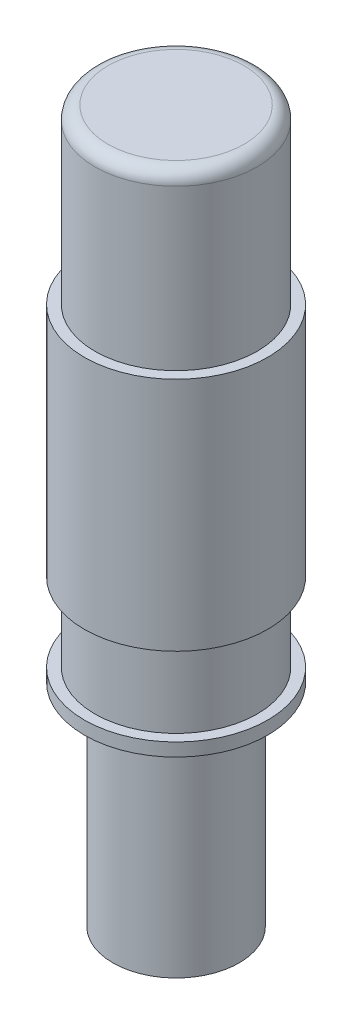
ISO-10303-21;
HEADER;
FILE_DESCRIPTION(('STEP AP214'),'2;1');
FILE_NAME('part.step','',(''),(''),'','','');
FILE_SCHEMA(('AUTOMOTIVE_DESIGN { 1 0 10303 214 1 1 1 1 }'));
ENDSEC;
DATA;
#1=APPLICATION_CONTEXT('core data for automotive mechanical design processes');
#2=APPLICATION_PROTOCOL_DEFINITION('international standard','automotive_design',2000,#1);
#3=PRODUCT_CONTEXT('',#1,'mechanical');
#4=PRODUCT('Part','Part','',(#3));
#5=PRODUCT_RELATED_PRODUCT_CATEGORY('part','',(#4));
#6=PRODUCT_DEFINITION_FORMATION('','',#4);
#7=PRODUCT_DEFINITION_CONTEXT('part definition',#1,'design');
#8=PRODUCT_DEFINITION('design','',#6,#7);
#9=PRODUCT_DEFINITION_SHAPE('','',#8);
#10=(LENGTH_UNIT() NAMED_UNIT(*) SI_UNIT(.MILLI.,.METRE.));
#11=(NAMED_UNIT(*) PLANE_ANGLE_UNIT() SI_UNIT($,.RADIAN.));
#12=(NAMED_UNIT(*) SI_UNIT($,.STERADIAN.) SOLID_ANGLE_UNIT());
#13=UNCERTAINTY_MEASURE_WITH_UNIT(LENGTH_MEASURE(1.E-05),#10,'distance_accuracy_value','');
#14=(GEOMETRIC_REPRESENTATION_CONTEXT(3) GLOBAL_UNCERTAINTY_ASSIGNED_CONTEXT((#13)) GLOBAL_UNIT_ASSIGNED_CONTEXT((#10,
#11,#12)) REPRESENTATION_CONTEXT('',''));
#15=CARTESIAN_POINT('',(0.,0.,0.));
#16=DIRECTION('',(0.,0.,1.));
#17=DIRECTION('',(1.,0.,0.));
#18=AXIS2_PLACEMENT_3D('',#15,#16,#17);
#19=CARTESIAN_POINT('',(0.,0.5,0.));
#20=DIRECTION('',(0.,-1.,0.));
#21=DIRECTION('',(0.,0.,-1.));
#22=AXIS2_PLACEMENT_3D('',#19,#20,#21);
#23=CYLINDRICAL_SURFACE('',#22,3.5);
#24=CARTESIAN_POINT('',(0.,0.5,0.));
#25=DIRECTION('',(0.,1.,0.));
#26=DIRECTION('',(0.,0.,1.));
#27=AXIS2_PLACEMENT_3D('',#24,#25,#26);
#28=CIRCLE('',#27,3.5);
#29=CARTESIAN_POINT('',(0.,0.5,3.5));
#30=VERTEX_POINT('',#29);
#31=EDGE_CURVE('E100',#30,#30,#28,.T.);
#32=ORIENTED_EDGE('',*,*,#31,.F.);
#33=EDGE_LOOP('',(#32));
#34=FACE_BOUND('',#33,.T.);
#35=CARTESIAN_POINT('',(0.,0.,0.));
#36=DIRECTION('',(0.,1.,0.));
#37=DIRECTION('',(0.,0.,1.));
#38=AXIS2_PLACEMENT_3D('',#35,#36,#37);
#39=CIRCLE('',#38,3.5);
#40=CARTESIAN_POINT('',(0.,0.,3.5));
#41=VERTEX_POINT('',#40);
#42=EDGE_CURVE('E97',#41,#41,#39,.T.);
#43=ORIENTED_EDGE('',*,*,#42,.T.);
#44=EDGE_LOOP('',(#43));
#45=FACE_BOUND('',#44,.T.);
#46=ADVANCED_FACE('F38',(#34,#45),#23,.T.);
#47=CARTESIAN_POINT('',(0.,0.5,0.));
#48=DIRECTION('',(0.,1.,0.));
#49=DIRECTION('',(0.,0.,1.));
#50=AXIS2_PLACEMENT_3D('',#47,#48,#49);
#51=PLANE('',#50);
#52=CARTESIAN_POINT('',(0.,0.5,0.));
#53=DIRECTION('',(0.,1.,0.));
#54=DIRECTION('',(0.,0.,1.));
#55=AXIS2_PLACEMENT_3D('',#52,#53,#54);
#56=CIRCLE('',#55,3.1);
#57=CARTESIAN_POINT('',(0.,0.5,3.1));
#58=VERTEX_POINT('',#57);
#59=EDGE_CURVE('E91',#58,#58,#56,.T.);
#60=ORIENTED_EDGE('',*,*,#59,.F.);
#61=EDGE_LOOP('',(#60));
#62=FACE_BOUND('',#61,.T.);
#63=ORIENTED_EDGE('',*,*,#31,.T.);
#64=EDGE_LOOP('',(#63));
#65=FACE_BOUND('',#64,.T.);
#66=ADVANCED_FACE('F120',(#62,#65),#51,.T.);
#67=CARTESIAN_POINT('',(0.,0.,0.));
#68=DIRECTION('',(0.,1.,0.));
#69=DIRECTION('',(0.,0.,1.));
#70=AXIS2_PLACEMENT_3D('',#67,#68,#69);
#71=PLANE('',#70);
#72=DIRECTION('',(1.,0.,0.));
#73=VECTOR('',#72,1.);
#74=CARTESIAN_POINT('',(0.,0.,-1.905));
#75=LINE('',#74,#73);
#76=CARTESIAN_POINT('',(-1.48106178129071,0.,-1.905));
#77=VERTEX_POINT('',#76);
#78=CARTESIAN_POINT('',(1.48106178129071,0.,-1.905));
#79=VERTEX_POINT('',#78);
#80=EDGE_CURVE('E65',#77,#79,#75,.T.);
#81=ORIENTED_EDGE('',*,*,#80,.F.);
#82=CARTESIAN_POINT('',(0.,0.,0.));
#83=DIRECTION('',(0.,-1.,0.));
#84=DIRECTION('',(0.,0.,-1.));
#85=AXIS2_PLACEMENT_3D('',#82,#83,#84);
#86=CIRCLE('',#85,2.413);
#87=EDGE_CURVE('E52',#79,#77,#86,.T.);
#88=ORIENTED_EDGE('',*,*,#87,.F.);
#89=EDGE_LOOP('',(#81,#88));
#90=FACE_BOUND('',#89,.T.);
#91=ORIENTED_EDGE('',*,*,#42,.F.);
#92=EDGE_LOOP('',(#91));
#93=FACE_BOUND('',#92,.T.);
#94=ADVANCED_FACE('F66',(#90,#93),#71,.F.);
#95=CARTESIAN_POINT('',(0.,3.5,0.));
#96=DIRECTION('',(0.,-1.,0.));
#97=DIRECTION('',(0.,0.,-1.));
#98=AXIS2_PLACEMENT_3D('',#95,#96,#97);
#99=CYLINDRICAL_SURFACE('',#98,3.1);
#100=CARTESIAN_POINT('',(0.,3.5,0.));
#101=DIRECTION('',(0.,1.,0.));
#102=DIRECTION('',(0.,0.,1.));
#103=AXIS2_PLACEMENT_3D('',#100,#101,#102);
#104=CIRCLE('',#103,3.1);
#105=CARTESIAN_POINT('',(0.,3.5,3.1));
#106=VERTEX_POINT('',#105);
#107=EDGE_CURVE('E94',#106,#106,#104,.T.);
#108=ORIENTED_EDGE('',*,*,#107,.F.);
#109=EDGE_LOOP('',(#108));
#110=FACE_BOUND('',#109,.T.);
#111=ORIENTED_EDGE('',*,*,#59,.T.);
#112=EDGE_LOOP('',(#111));
#113=FACE_BOUND('',#112,.T.);
#114=ADVANCED_FACE('F131',(#110,#113),#99,.T.);
#115=CARTESIAN_POINT('',(0.,12.5,0.));
#116=DIRECTION('',(0.,-1.,0.));
#117=DIRECTION('',(0.,0.,-1.));
#118=AXIS2_PLACEMENT_3D('',#115,#116,#117);
#119=CYLINDRICAL_SURFACE('',#118,3.5);
#120=CARTESIAN_POINT('',(0.,12.5,0.));
#121=DIRECTION('',(0.,1.,0.));
#122=DIRECTION('',(0.,0.,1.));
#123=AXIS2_PLACEMENT_3D('',#120,#121,#122);
#124=CIRCLE('',#123,3.5);
#125=CARTESIAN_POINT('',(0.,12.5,3.5));
#126=VERTEX_POINT('',#125);
#127=EDGE_CURVE('E88',#126,#126,#124,.T.);
#128=ORIENTED_EDGE('',*,*,#127,.F.);
#129=EDGE_LOOP('',(#128));
#130=FACE_BOUND('',#129,.T.);
#131=CARTESIAN_POINT('',(0.,3.5,0.));
#132=DIRECTION('',(0.,1.,0.));
#133=DIRECTION('',(0.,0.,1.));
#134=AXIS2_PLACEMENT_3D('',#131,#132,#133);
#135=CIRCLE('',#134,3.5);
#136=CARTESIAN_POINT('',(0.,3.5,3.5));
#137=VERTEX_POINT('',#136);
#138=EDGE_CURVE('E87',#137,#137,#135,.T.);
#139=ORIENTED_EDGE('',*,*,#138,.T.);
#140=EDGE_LOOP('',(#139));
#141=FACE_BOUND('',#140,.T.);
#142=ADVANCED_FACE('F135',(#130,#141),#119,.T.);
#143=CARTESIAN_POINT('',(0.,12.5,0.));
#144=DIRECTION('',(0.,1.,0.));
#145=DIRECTION('',(0.,0.,1.));
#146=AXIS2_PLACEMENT_3D('',#143,#144,#145);
#147=PLANE('',#146);
#148=CARTESIAN_POINT('',(0.,12.5,0.));
#149=DIRECTION('',(0.,1.,0.));
#150=DIRECTION('',(0.,0.,1.));
#151=AXIS2_PLACEMENT_3D('',#148,#149,#150);
#152=CIRCLE('',#151,3.1);
#153=CARTESIAN_POINT('',(0.,12.5,3.1));
#154=VERTEX_POINT('',#153);
#155=EDGE_CURVE('E81',#154,#154,#152,.T.);
#156=ORIENTED_EDGE('',*,*,#155,.F.);
#157=EDGE_LOOP('',(#156));
#158=FACE_BOUND('',#157,.T.);
#159=ORIENTED_EDGE('',*,*,#127,.T.);
#160=EDGE_LOOP('',(#159));
#161=FACE_BOUND('',#160,.T.);
#162=ADVANCED_FACE('F139',(#158,#161),#147,.T.);
#163=CARTESIAN_POINT('',(0.,3.5,0.));
#164=DIRECTION('',(0.,1.,0.));
#165=DIRECTION('',(0.,0.,1.));
#166=AXIS2_PLACEMENT_3D('',#163,#164,#165);
#167=PLANE('',#166);
#168=ORIENTED_EDGE('',*,*,#107,.T.);
#169=EDGE_LOOP('',(#168));
#170=FACE_BOUND('',#169,.T.);
#171=ORIENTED_EDGE('',*,*,#138,.F.);
#172=EDGE_LOOP('',(#171));
#173=FACE_BOUND('',#172,.T.);
#174=ADVANCED_FACE('F141',(#170,#173),#167,.F.);
#175=CARTESIAN_POINT('',(0.,19.1,0.));
#176=DIRECTION('',(0.,-1.,0.));
#177=DIRECTION('',(0.,0.,-1.));
#178=AXIS2_PLACEMENT_3D('',#175,#176,#177);
#179=CYLINDRICAL_SURFACE('',#178,3.1);
#180=CARTESIAN_POINT('',(0.,18.6,0.));
#181=DIRECTION('',(0.,1.,0.));
#182=DIRECTION('',(0.,0.,1.));
#183=AXIS2_PLACEMENT_3D('',#180,#181,#182);
#184=CIRCLE('',#183,3.1);
#185=CARTESIAN_POINT('',(0.,18.6,3.1));
#186=VERTEX_POINT('',#185);
#187=EDGE_CURVE('E11',#186,#186,#184,.F.);
#188=ORIENTED_EDGE('',*,*,#187,.T.);
#189=EDGE_LOOP('',(#188));
#190=FACE_BOUND('',#189,.T.);
#191=ORIENTED_EDGE('',*,*,#155,.T.);
#192=EDGE_LOOP('',(#191));
#193=FACE_BOUND('',#192,.T.);
#194=ADVANCED_FACE('F116',(#190,#193),#179,.T.);
#195=CARTESIAN_POINT('',(0.,19.1,0.));
#196=DIRECTION('',(0.,1.,0.));
#197=DIRECTION('',(0.,0.,1.));
#198=AXIS2_PLACEMENT_3D('',#195,#196,#197);
#199=PLANE('',#198);
#200=CARTESIAN_POINT('',(0.,19.1,0.));
#201=DIRECTION('',(0.,1.,0.));
#202=DIRECTION('',(0.,0.,1.));
#203=AXIS2_PLACEMENT_3D('',#200,#201,#202);
#204=CIRCLE('',#203,2.6);
#205=CARTESIAN_POINT('',(0.,19.1,2.6));
#206=VERTEX_POINT('',#205);
#207=EDGE_CURVE('E46',#206,#206,#204,.T.);
#208=ORIENTED_EDGE('',*,*,#207,.T.);
#209=EDGE_LOOP('',(#208));
#210=FACE_BOUND('',#209,.T.);
#211=ADVANCED_FACE('F107',(#210),#199,.T.);
#212=CARTESIAN_POINT('',(0.,18.6,0.));
#213=DIRECTION('',(0.,1.,0.));
#214=DIRECTION('',(0.,0.,1.));
#215=AXIS2_PLACEMENT_3D('',#212,#213,#214);
#216=TOROIDAL_SURFACE('',#215,2.6,0.5);
#217=ORIENTED_EDGE('',*,*,#187,.F.);
#218=EDGE_LOOP('',(#217));
#219=FACE_BOUND('',#218,.T.);
#220=ORIENTED_EDGE('',*,*,#207,.F.);
#221=EDGE_LOOP('',(#220));
#222=FACE_BOUND('',#221,.T.);
#223=ADVANCED_FACE('F40',(#219,#222),#216,.T.);
#224=CARTESIAN_POINT('',(0.,-8.0772,-1.905));
#225=DIRECTION('',(0.,0.,1.));
#226=DIRECTION('',(1.,0.,0.));
#227=AXIS2_PLACEMENT_3D('',#224,#225,#226);
#228=PLANE('',#227);
#229=ORIENTED_EDGE('',*,*,#80,.T.);
#230=DIRECTION('',(0.,1.,0.));
#231=VECTOR('',#230,1.);
#232=CARTESIAN_POINT('',(1.48106178129071,-8.0772,-1.905));
#233=LINE('',#232,#231);
#234=CARTESIAN_POINT('',(1.48106178129071,-8.0772,-1.905));
#235=VERTEX_POINT('',#234);
#236=EDGE_CURVE('E76',#235,#79,#233,.T.);
#237=ORIENTED_EDGE('',*,*,#236,.F.);
#238=DIRECTION('',(1.,0.,0.));
#239=VECTOR('',#238,1.);
#240=CARTESIAN_POINT('',(0.,-8.0772,-1.905));
#241=LINE('',#240,#239);
#242=CARTESIAN_POINT('',(-1.48106178129071,-8.0772,-1.905));
#243=VERTEX_POINT('',#242);
#244=EDGE_CURVE('E77',#243,#235,#241,.T.);
#245=ORIENTED_EDGE('',*,*,#244,.F.);
#246=DIRECTION('',(0.,1.,0.));
#247=VECTOR('',#246,1.);
#248=CARTESIAN_POINT('',(-1.48106178129071,-8.0772,-1.905));
#249=LINE('',#248,#247);
#250=EDGE_CURVE('E74',#243,#77,#249,.T.);
#251=ORIENTED_EDGE('',*,*,#250,.T.);
#252=EDGE_LOOP('',(#229,#237,#245,#251));
#253=FACE_BOUND('',#252,.T.);
#254=ADVANCED_FACE('F79',(#253),#228,.F.);
#255=CARTESIAN_POINT('',(0.,-8.0772,0.));
#256=DIRECTION('',(0.,1.,0.));
#257=DIRECTION('',(0.,0.,1.));
#258=AXIS2_PLACEMENT_3D('',#255,#256,#257);
#259=CYLINDRICAL_SURFACE('',#258,2.413);
#260=ORIENTED_EDGE('',*,*,#87,.T.);
#261=ORIENTED_EDGE('',*,*,#250,.F.);
#262=CARTESIAN_POINT('',(0.,-8.0772,0.));
#263=DIRECTION('',(0.,-1.,0.));
#264=DIRECTION('',(0.,0.,-1.));
#265=AXIS2_PLACEMENT_3D('',#262,#263,#264);
#266=CIRCLE('',#265,2.413);
#267=EDGE_CURVE('E60',#235,#243,#266,.T.);
#268=ORIENTED_EDGE('',*,*,#267,.F.);
#269=ORIENTED_EDGE('',*,*,#236,.T.);
#270=EDGE_LOOP('',(#260,#261,#268,#269));
#271=FACE_BOUND('',#270,.T.);
#272=ADVANCED_FACE('F73',(#271),#259,.T.);
#273=CARTESIAN_POINT('',(0.,-8.0772,0.));
#274=DIRECTION('',(0.,-1.,0.));
#275=DIRECTION('',(0.,0.,-1.));
#276=AXIS2_PLACEMENT_3D('',#273,#274,#275);
#277=PLANE('',#276);
#278=ORIENTED_EDGE('',*,*,#244,.T.);
#279=ORIENTED_EDGE('',*,*,#267,.T.);
#280=EDGE_LOOP('',(#278,#279));
#281=FACE_BOUND('',#280,.T.);
#282=ADVANCED_FACE('F153',(#281),#277,.T.);
#283=CLOSED_SHELL('',(#46,#66,#94,#114,#142,#162,#174,#194,#211,#223,#254,#272,#282));
#284=MANIFOLD_SOLID_BREP('B2',#283);
#285=ADVANCED_BREP_SHAPE_REPRESENTATION('',(#18,#284),#14);
#286=SHAPE_DEFINITION_REPRESENTATION(#9,#285);
ENDSEC;
END-ISO-10303-21;
